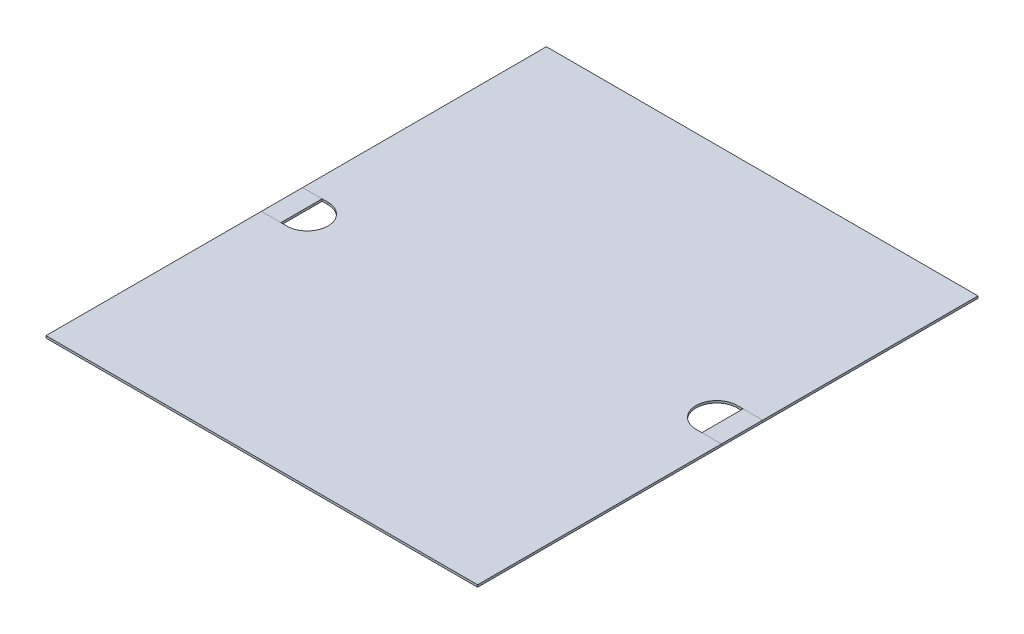
ISO-10303-21;
HEADER;
FILE_DESCRIPTION(('STEP AP214'),'2;1');
FILE_NAME('part.step','',(''),(''),'','','');
FILE_SCHEMA(('AUTOMOTIVE_DESIGN { 1 0 10303 214 1 1 1 1 }'));
ENDSEC;
DATA;
#1=APPLICATION_CONTEXT('core data for automotive mechanical design processes');
#2=APPLICATION_PROTOCOL_DEFINITION('international standard','automotive_design',2000,#1);
#3=PRODUCT_CONTEXT('',#1,'mechanical');
#4=PRODUCT('Part','Part','',(#3));
#5=PRODUCT_RELATED_PRODUCT_CATEGORY('part','',(#4));
#6=PRODUCT_DEFINITION_FORMATION('','',#4);
#7=PRODUCT_DEFINITION_CONTEXT('part definition',#1,'design');
#8=PRODUCT_DEFINITION('design','',#6,#7);
#9=PRODUCT_DEFINITION_SHAPE('','',#8);
#10=(LENGTH_UNIT() NAMED_UNIT(*) SI_UNIT(.MILLI.,.METRE.));
#11=(NAMED_UNIT(*) PLANE_ANGLE_UNIT() SI_UNIT($,.RADIAN.));
#12=(NAMED_UNIT(*) SI_UNIT($,.STERADIAN.) SOLID_ANGLE_UNIT());
#13=UNCERTAINTY_MEASURE_WITH_UNIT(LENGTH_MEASURE(1.E-05),#10,'distance_accuracy_value','');
#14=(GEOMETRIC_REPRESENTATION_CONTEXT(3) GLOBAL_UNCERTAINTY_ASSIGNED_CONTEXT((#13)) GLOBAL_UNIT_ASSIGNED_CONTEXT((#10,
#11,#12)) REPRESENTATION_CONTEXT('',''));
#15=CARTESIAN_POINT('',(0.,0.,0.));
#16=DIRECTION('',(0.,0.,1.));
#17=DIRECTION('',(1.,0.,0.));
#18=AXIS2_PLACEMENT_3D('',#15,#16,#17);
#19=CARTESIAN_POINT('',(198.959369160678,0.,-131.450000000058));
#20=DIRECTION('',(1.,0.,0.));
#21=DIRECTION('',(0.,0.,-1.));
#22=AXIS2_PLACEMENT_3D('',#19,#20,#21);
#23=PLANE('',#22);
#24=DIRECTION('',(0.,0.,-1.));
#25=VECTOR('',#24,1.);
#26=CARTESIAN_POINT('',(198.959369160678,1.,-131.450000000058));
#27=LINE('',#26,#25);
#28=CARTESIAN_POINT('',(198.959369160678,1.,-112.450000000058));
#29=VERTEX_POINT('',#28);
#30=CARTESIAN_POINT('',(198.959369160678,1.,-131.450000000058));
#31=VERTEX_POINT('',#30);
#32=EDGE_CURVE('E12',#29,#31,#27,.T.);
#33=ORIENTED_EDGE('',*,*,#32,.F.);
#34=DIRECTION('',(0.,1.,0.));
#35=VECTOR('',#34,1.);
#36=CARTESIAN_POINT('',(198.959369160678,0.,-112.450000000058));
#37=LINE('',#36,#35);
#38=CARTESIAN_POINT('',(198.959369160678,0.,-112.450000000058));
#39=VERTEX_POINT('',#38);
#40=EDGE_CURVE('E101',#39,#29,#37,.T.);
#41=ORIENTED_EDGE('',*,*,#40,.F.);
#42=DIRECTION('',(0.,0.,-1.));
#43=VECTOR('',#42,1.);
#44=CARTESIAN_POINT('',(198.959369160678,0.,-131.450000000058));
#45=LINE('',#44,#43);
#46=CARTESIAN_POINT('',(198.959369160678,0.,-131.450000000058));
#47=VERTEX_POINT('',#46);
#48=EDGE_CURVE('E58',#39,#47,#45,.T.);
#49=ORIENTED_EDGE('',*,*,#48,.T.);
#50=DIRECTION('',(0.,1.,0.));
#51=VECTOR('',#50,1.);
#52=CARTESIAN_POINT('',(198.959369160678,0.,-131.450000000058));
#53=LINE('',#52,#51);
#54=EDGE_CURVE('E73',#47,#31,#53,.T.);
#55=ORIENTED_EDGE('',*,*,#54,.T.);
#56=EDGE_LOOP('',(#33,#41,#49,#55));
#57=FACE_BOUND('',#56,.T.);
#58=ADVANCED_FACE('F54',(#57),#23,.T.);
#59=CARTESIAN_POINT('',(198.959369160678,0.,-112.450000000058));
#60=DIRECTION('',(0.,0.,1.));
#61=DIRECTION('',(1.,0.,0.));
#62=AXIS2_PLACEMENT_3D('',#59,#60,#61);
#63=PLANE('',#62);
#64=DIRECTION('',(1.,0.,0.));
#65=VECTOR('',#64,1.);
#66=CARTESIAN_POINT('',(198.959369160678,1.,-112.450000000058));
#67=LINE('',#66,#65);
#68=CARTESIAN_POINT('',(189.959369160678,1.,-112.450000000058));
#69=VERTEX_POINT('',#68);
#70=EDGE_CURVE('E114',#69,#29,#67,.T.);
#71=ORIENTED_EDGE('',*,*,#70,.F.);
#72=DIRECTION('',(0.,1.,0.));
#73=VECTOR('',#72,1.);
#74=CARTESIAN_POINT('',(189.959369160678,0.,-112.450000000058));
#75=LINE('',#74,#73);
#76=CARTESIAN_POINT('',(189.959369160678,0.,-112.450000000058));
#77=VERTEX_POINT('',#76);
#78=EDGE_CURVE('E103',#77,#69,#75,.T.);
#79=ORIENTED_EDGE('',*,*,#78,.F.);
#80=DIRECTION('',(1.,0.,0.));
#81=VECTOR('',#80,1.);
#82=CARTESIAN_POINT('',(198.959369160678,0.,-112.450000000058));
#83=LINE('',#82,#81);
#84=EDGE_CURVE('E122',#77,#39,#83,.T.);
#85=ORIENTED_EDGE('',*,*,#84,.T.);
#86=ORIENTED_EDGE('',*,*,#40,.T.);
#87=EDGE_LOOP('',(#71,#79,#85,#86));
#88=FACE_BOUND('',#87,.T.);
#89=ADVANCED_FACE('F116',(#88),#63,.T.);
#90=CARTESIAN_POINT('',(189.959369160678,0.,-131.450000000058));
#91=DIRECTION('',(-1.,0.,0.));
#92=DIRECTION('',(0.,0.,1.));
#93=AXIS2_PLACEMENT_3D('',#90,#91,#92);
#94=PLANE('',#93);
#95=DIRECTION('',(0.,0.,1.));
#96=VECTOR('',#95,1.);
#97=CARTESIAN_POINT('',(189.959369160678,1.,-131.450000000058));
#98=LINE('',#97,#96);
#99=CARTESIAN_POINT('',(189.959369160678,1.,-131.450000000058));
#100=VERTEX_POINT('',#99);
#101=EDGE_CURVE('E106',#100,#69,#98,.T.);
#102=ORIENTED_EDGE('',*,*,#101,.F.);
#103=DIRECTION('',(0.,1.,0.));
#104=VECTOR('',#103,1.);
#105=CARTESIAN_POINT('',(189.959369160678,0.,-131.450000000058));
#106=LINE('',#105,#104);
#107=CARTESIAN_POINT('',(189.959369160678,0.,-131.450000000058));
#108=VERTEX_POINT('',#107);
#109=EDGE_CURVE('E90',#108,#100,#106,.T.);
#110=ORIENTED_EDGE('',*,*,#109,.F.);
#111=DIRECTION('',(0.,0.,1.));
#112=VECTOR('',#111,1.);
#113=CARTESIAN_POINT('',(189.959369160678,0.,-131.450000000058));
#114=LINE('',#113,#112);
#115=EDGE_CURVE('E108',#108,#77,#114,.T.);
#116=ORIENTED_EDGE('',*,*,#115,.T.);
#117=ORIENTED_EDGE('',*,*,#78,.T.);
#118=EDGE_LOOP('',(#102,#110,#116,#117));
#119=FACE_BOUND('',#118,.T.);
#120=ADVANCED_FACE('F105',(#119),#94,.T.);
#121=CARTESIAN_POINT('',(198.959369160678,0.,-131.450000000058));
#122=DIRECTION('',(0.,0.,-1.));
#123=DIRECTION('',(-1.,0.,0.));
#124=AXIS2_PLACEMENT_3D('',#121,#122,#123);
#125=PLANE('',#124);
#126=DIRECTION('',(-1.,0.,0.));
#127=VECTOR('',#126,1.);
#128=CARTESIAN_POINT('',(198.959369160678,1.,-131.450000000058));
#129=LINE('',#128,#127);
#130=EDGE_CURVE('E64',#31,#100,#129,.T.);
#131=ORIENTED_EDGE('',*,*,#130,.F.);
#132=ORIENTED_EDGE('',*,*,#54,.F.);
#133=DIRECTION('',(-1.,0.,0.));
#134=VECTOR('',#133,1.);
#135=CARTESIAN_POINT('',(198.959369160678,0.,-131.450000000058));
#136=LINE('',#135,#134);
#137=EDGE_CURVE('E118',#47,#108,#136,.T.);
#138=ORIENTED_EDGE('',*,*,#137,.T.);
#139=ORIENTED_EDGE('',*,*,#109,.T.);
#140=EDGE_LOOP('',(#131,#132,#138,#139));
#141=FACE_BOUND('',#140,.T.);
#142=ADVANCED_FACE('F124',(#141),#125,.T.);
#143=CARTESIAN_POINT('',(0.,0.,0.));
#144=DIRECTION('',(0.,-1.,0.));
#145=DIRECTION('',(0.,0.,-1.));
#146=AXIS2_PLACEMENT_3D('',#143,#144,#145);
#147=PLANE('',#146);
#148=ORIENTED_EDGE('',*,*,#48,.F.);
#149=ORIENTED_EDGE('',*,*,#84,.F.);
#150=ORIENTED_EDGE('',*,*,#115,.F.);
#151=ORIENTED_EDGE('',*,*,#137,.F.);
#152=EDGE_LOOP('',(#148,#149,#150,#151));
#153=FACE_BOUND('',#152,.T.);
#154=ADVANCED_FACE('F56',(#153),#147,.T.);
#155=CARTESIAN_POINT('',(0.,1.,0.));
#156=DIRECTION('',(0.,-1.,0.));
#157=DIRECTION('',(0.,0.,-1.));
#158=AXIS2_PLACEMENT_3D('',#155,#156,#157);
#159=PLANE('',#158);
#160=ORIENTED_EDGE('',*,*,#32,.T.);
#161=ORIENTED_EDGE('',*,*,#130,.T.);
#162=ORIENTED_EDGE('',*,*,#101,.T.);
#163=ORIENTED_EDGE('',*,*,#70,.T.);
#164=EDGE_LOOP('',(#160,#161,#162,#163));
#165=FACE_BOUND('',#164,.T.);
#166=ADVANCED_FACE('F113',(#165),#159,.F.);
#167=CLOSED_SHELL('',(#58,#89,#120,#142,#154,#166));
#168=MANIFOLD_SOLID_BREP('B2',#167);
#169=CARTESIAN_POINT('',(0.0406308393223753,0.,-118.25));
#170=DIRECTION('',(-1.,0.,0.));
#171=DIRECTION('',(0.,0.,1.));
#172=AXIS2_PLACEMENT_3D('',#169,#170,#171);
#173=PLANE('',#172);
#174=DIRECTION('',(0.,0.,1.));
#175=VECTOR('',#174,1.);
#176=CARTESIAN_POINT('',(0.0406308393223753,1.,-118.25));
#177=LINE('',#176,#175);
#178=CARTESIAN_POINT('',(0.0406308393223753,1.,-118.25));
#179=VERTEX_POINT('',#178);
#180=CARTESIAN_POINT('',(0.0406308393223753,1.,-99.25));
#181=VERTEX_POINT('',#180);
#182=EDGE_CURVE('E263',#179,#181,#177,.T.);
#183=ORIENTED_EDGE('',*,*,#182,.F.);
#184=DIRECTION('',(0.,1.,0.));
#185=VECTOR('',#184,1.);
#186=CARTESIAN_POINT('',(0.0406308393223753,0.,-118.25));
#187=LINE('',#186,#185);
#188=CARTESIAN_POINT('',(0.0406308393223753,0.,-118.25));
#189=VERTEX_POINT('',#188);
#190=EDGE_CURVE('E52',#189,#179,#187,.T.);
#191=ORIENTED_EDGE('',*,*,#190,.F.);
#192=DIRECTION('',(0.,0.,1.));
#193=VECTOR('',#192,1.);
#194=CARTESIAN_POINT('',(0.0406308393223753,0.,-118.25));
#195=LINE('',#194,#193);
#196=CARTESIAN_POINT('',(0.0406308393223753,0.,-99.25));
#197=VERTEX_POINT('',#196);
#198=EDGE_CURVE('E257',#189,#197,#195,.T.);
#199=ORIENTED_EDGE('',*,*,#198,.T.);
#200=DIRECTION('',(0.,1.,0.));
#201=VECTOR('',#200,1.);
#202=CARTESIAN_POINT('',(0.0406308393223753,0.,-99.25));
#203=LINE('',#202,#201);
#204=EDGE_CURVE('E202',#197,#181,#203,.T.);
#205=ORIENTED_EDGE('',*,*,#204,.T.);
#206=EDGE_LOOP('',(#183,#191,#199,#205));
#207=FACE_BOUND('',#206,.T.);
#208=ADVANCED_FACE('F199',(#207),#173,.T.);
#209=CARTESIAN_POINT('',(0.0406308393223753,0.,-118.25));
#210=DIRECTION('',(0.,0.,-1.));
#211=DIRECTION('',(-1.,0.,0.));
#212=AXIS2_PLACEMENT_3D('',#209,#210,#211);
#213=PLANE('',#212);
#214=DIRECTION('',(-1.,0.,0.));
#215=VECTOR('',#214,1.);
#216=CARTESIAN_POINT('',(0.0406308393223753,1.,-118.25));
#217=LINE('',#216,#215);
#218=CARTESIAN_POINT('',(9.04063083932238,1.,-118.25));
#219=VERTEX_POINT('',#218);
#220=EDGE_CURVE('E259',#219,#179,#217,.T.);
#221=ORIENTED_EDGE('',*,*,#220,.F.);
#222=DIRECTION('',(0.,1.,0.));
#223=VECTOR('',#222,1.);
#224=CARTESIAN_POINT('',(9.04063083932238,0.,-118.25));
#225=LINE('',#224,#223);
#226=CARTESIAN_POINT('',(9.04063083932238,0.,-118.25));
#227=VERTEX_POINT('',#226);
#228=EDGE_CURVE('E208',#227,#219,#225,.T.);
#229=ORIENTED_EDGE('',*,*,#228,.F.);
#230=DIRECTION('',(-1.,0.,0.));
#231=VECTOR('',#230,1.);
#232=CARTESIAN_POINT('',(0.0406308393223753,0.,-118.25));
#233=LINE('',#232,#231);
#234=EDGE_CURVE('E254',#227,#189,#233,.T.);
#235=ORIENTED_EDGE('',*,*,#234,.T.);
#236=ORIENTED_EDGE('',*,*,#190,.T.);
#237=EDGE_LOOP('',(#221,#229,#235,#236));
#238=FACE_BOUND('',#237,.T.);
#239=ADVANCED_FACE('F273',(#238),#213,.T.);
#240=CARTESIAN_POINT('',(9.04063083932238,0.,-118.25));
#241=DIRECTION('',(1.,0.,0.));
#242=DIRECTION('',(0.,0.,-1.));
#243=AXIS2_PLACEMENT_3D('',#240,#241,#242);
#244=PLANE('',#243);
#245=DIRECTION('',(0.,0.,-1.));
#246=VECTOR('',#245,1.);
#247=CARTESIAN_POINT('',(9.04063083932238,1.,-118.25));
#248=LINE('',#247,#246);
#249=CARTESIAN_POINT('',(9.04063083932238,1.,-99.25));
#250=VERTEX_POINT('',#249);
#251=EDGE_CURVE('E249',#250,#219,#248,.T.);
#252=ORIENTED_EDGE('',*,*,#251,.F.);
#253=DIRECTION('',(0.,1.,0.));
#254=VECTOR('',#253,1.);
#255=CARTESIAN_POINT('',(9.04063083932238,0.,-99.25));
#256=LINE('',#255,#254);
#257=CARTESIAN_POINT('',(9.04063083932238,0.,-99.25));
#258=VERTEX_POINT('',#257);
#259=EDGE_CURVE('E244',#258,#250,#256,.T.);
#260=ORIENTED_EDGE('',*,*,#259,.F.);
#261=DIRECTION('',(0.,0.,-1.));
#262=VECTOR('',#261,1.);
#263=CARTESIAN_POINT('',(9.04063083932238,0.,-118.25));
#264=LINE('',#263,#262);
#265=EDGE_CURVE('E247',#258,#227,#264,.T.);
#266=ORIENTED_EDGE('',*,*,#265,.T.);
#267=ORIENTED_EDGE('',*,*,#228,.T.);
#268=EDGE_LOOP('',(#252,#260,#266,#267));
#269=FACE_BOUND('',#268,.T.);
#270=ADVANCED_FACE('F246',(#269),#244,.T.);
#271=CARTESIAN_POINT('',(0.0406308393223753,0.,-99.25));
#272=DIRECTION('',(0.,0.,1.));
#273=DIRECTION('',(1.,0.,0.));
#274=AXIS2_PLACEMENT_3D('',#271,#272,#273);
#275=PLANE('',#274);
#276=DIRECTION('',(1.,0.,0.));
#277=VECTOR('',#276,1.);
#278=CARTESIAN_POINT('',(0.0406308393223753,1.,-99.25));
#279=LINE('',#278,#277);
#280=EDGE_CURVE('E266',#181,#250,#279,.T.);
#281=ORIENTED_EDGE('',*,*,#280,.F.);
#282=ORIENTED_EDGE('',*,*,#204,.F.);
#283=DIRECTION('',(1.,0.,0.));
#284=VECTOR('',#283,1.);
#285=CARTESIAN_POINT('',(0.0406308393223753,0.,-99.25));
#286=LINE('',#285,#284);
#287=EDGE_CURVE('E253',#197,#258,#286,.T.);
#288=ORIENTED_EDGE('',*,*,#287,.T.);
#289=ORIENTED_EDGE('',*,*,#259,.T.);
#290=EDGE_LOOP('',(#281,#282,#288,#289));
#291=FACE_BOUND('',#290,.T.);
#292=ADVANCED_FACE('F256',(#291),#275,.T.);
#293=CARTESIAN_POINT('',(0.,0.,0.));
#294=DIRECTION('',(0.,1.,0.));
#295=DIRECTION('',(0.,0.,1.));
#296=AXIS2_PLACEMENT_3D('',#293,#294,#295);
#297=PLANE('',#296);
#298=ORIENTED_EDGE('',*,*,#198,.F.);
#299=ORIENTED_EDGE('',*,*,#234,.F.);
#300=ORIENTED_EDGE('',*,*,#265,.F.);
#301=ORIENTED_EDGE('',*,*,#287,.F.);
#302=EDGE_LOOP('',(#298,#299,#300,#301));
#303=FACE_BOUND('',#302,.T.);
#304=ADVANCED_FACE('F252',(#303),#297,.F.);
#305=CARTESIAN_POINT('',(0.,1.,0.));
#306=DIRECTION('',(0.,1.,0.));
#307=DIRECTION('',(0.,0.,1.));
#308=AXIS2_PLACEMENT_3D('',#305,#306,#307);
#309=PLANE('',#308);
#310=ORIENTED_EDGE('',*,*,#182,.T.);
#311=ORIENTED_EDGE('',*,*,#280,.T.);
#312=ORIENTED_EDGE('',*,*,#251,.T.);
#313=ORIENTED_EDGE('',*,*,#220,.T.);
#314=EDGE_LOOP('',(#310,#311,#312,#313));
#315=FACE_BOUND('',#314,.T.);
#316=ADVANCED_FACE('F272',(#315),#309,.T.);
#317=CLOSED_SHELL('',(#208,#239,#270,#292,#304,#316));
#318=MANIFOLD_SOLID_BREP('B6',#317);
#319=CARTESIAN_POINT('',(0.0406308393223753,1.,-99.25));
#320=DIRECTION('',(0.999999916204537,0.,0.000409378699422623));
#321=DIRECTION('',(0.000409378699422623,0.,-0.999999916204537));
#322=AXIS2_PLACEMENT_3D('',#319,#320,#321);
#323=PLANE('',#322);
#324=DIRECTION('',(-0.000409378699422623,0.,0.999999916204537));
#325=VECTOR('',#324,1.);
#326=CARTESIAN_POINT('',(0.0406308393223753,0.,-99.25));
#327=LINE('',#326,#325);
#328=CARTESIAN_POINT('',(0.0406308393223753,0.,-99.25));
#329=VERTEX_POINT('',#328);
#330=CARTESIAN_POINT('',(0.,0.,0.));
#331=VERTEX_POINT('',#330);
#332=EDGE_CURVE('E460',#329,#331,#327,.T.);
#333=ORIENTED_EDGE('',*,*,#332,.T.);
#334=DIRECTION('',(0.,-1.,0.));
#335=VECTOR('',#334,1.);
#336=CARTESIAN_POINT('',(0.,1.,0.));
#337=LINE('',#336,#335);
#338=CARTESIAN_POINT('',(0.,1.,0.));
#339=VERTEX_POINT('',#338);
#340=EDGE_CURVE('E197',#339,#331,#337,.T.);
#341=ORIENTED_EDGE('',*,*,#340,.F.);
#342=DIRECTION('',(-0.000409378699422623,0.,0.999999916204537));
#343=VECTOR('',#342,1.);
#344=CARTESIAN_POINT('',(0.0406308393223753,1.,-99.25));
#345=LINE('',#344,#343);
#346=CARTESIAN_POINT('',(0.0406308393223753,1.,-99.25));
#347=VERTEX_POINT('',#346);
#348=EDGE_CURVE('E494',#347,#339,#345,.T.);
#349=ORIENTED_EDGE('',*,*,#348,.F.);
#350=DIRECTION('',(0.,-1.,0.));
#351=VECTOR('',#350,1.);
#352=CARTESIAN_POINT('',(0.0406308393223753,1.,-99.25));
#353=LINE('',#352,#351);
#354=EDGE_CURVE('E456',#347,#329,#353,.T.);
#355=ORIENTED_EDGE('',*,*,#354,.T.);
#356=EDGE_LOOP('',(#333,#341,#349,#355));
#357=FACE_BOUND('',#356,.T.);
#358=ADVANCED_FACE('F335',(#357),#323,.F.);
#359=CARTESIAN_POINT('',(0.,1.,0.));
#360=DIRECTION('',(0.,0.,-1.));
#361=DIRECTION('',(-1.,0.,0.));
#362=AXIS2_PLACEMENT_3D('',#359,#360,#361);
#363=PLANE('',#362);
#364=DIRECTION('',(1.,0.,0.));
#365=VECTOR('',#364,1.);
#366=CARTESIAN_POINT('',(0.,0.,0.));
#367=LINE('',#366,#365);
#368=CARTESIAN_POINT('',(199.,0.,0.));
#369=VERTEX_POINT('',#368);
#370=EDGE_CURVE('E464',#331,#369,#367,.T.);
#371=ORIENTED_EDGE('',*,*,#370,.T.);
#372=DIRECTION('',(0.,-1.,0.));
#373=VECTOR('',#372,1.);
#374=CARTESIAN_POINT('',(199.,1.,0.));
#375=LINE('',#374,#373);
#376=CARTESIAN_POINT('',(199.,1.,0.));
#377=VERTEX_POINT('',#376);
#378=EDGE_CURVE('E344',#377,#369,#375,.T.);
#379=ORIENTED_EDGE('',*,*,#378,.F.);
#380=DIRECTION('',(1.,0.,0.));
#381=VECTOR('',#380,1.);
#382=CARTESIAN_POINT('',(0.,1.,0.));
#383=LINE('',#382,#381);
#384=EDGE_CURVE('E407',#339,#377,#383,.T.);
#385=ORIENTED_EDGE('',*,*,#384,.F.);
#386=ORIENTED_EDGE('',*,*,#340,.T.);
#387=EDGE_LOOP('',(#371,#379,#385,#386));
#388=FACE_BOUND('',#387,.T.);
#389=ADVANCED_FACE('F588',(#388),#363,.F.);
#390=CARTESIAN_POINT('',(198.959369160678,1.,-112.450000000058));
#391=DIRECTION('',(-0.999999934722633,0.,0.00036132358088135));
#392=DIRECTION('',(0.00036132358088135,0.,0.999999934722633));
#393=AXIS2_PLACEMENT_3D('',#390,#391,#392);
#394=PLANE('',#393);
#395=DIRECTION('',(-0.00036132358088135,0.,-0.999999934722633));
#396=VECTOR('',#395,1.);
#397=CARTESIAN_POINT('',(198.959369160678,0.,-112.450000000058));
#398=LINE('',#397,#396);
#399=CARTESIAN_POINT('',(198.959369160678,0.,-112.450000000058));
#400=VERTEX_POINT('',#399);
#401=EDGE_CURVE('E467',#369,#400,#398,.T.);
#402=ORIENTED_EDGE('',*,*,#401,.T.);
#403=DIRECTION('',(0.,-1.,0.));
#404=VECTOR('',#403,1.);
#405=CARTESIAN_POINT('',(198.959369160678,1.,-112.450000000058));
#406=LINE('',#405,#404);
#407=CARTESIAN_POINT('',(198.959369160678,1.,-112.450000000058));
#408=VERTEX_POINT('',#407);
#409=EDGE_CURVE('E521',#408,#400,#406,.T.);
#410=ORIENTED_EDGE('',*,*,#409,.F.);
#411=DIRECTION('',(-0.00036132358088135,0.,-0.999999934722633));
#412=VECTOR('',#411,1.);
#413=CARTESIAN_POINT('',(198.959369160678,1.,-112.450000000058));
#414=LINE('',#413,#412);
#415=EDGE_CURVE('E531',#377,#408,#414,.T.);
#416=ORIENTED_EDGE('',*,*,#415,.F.);
#417=ORIENTED_EDGE('',*,*,#378,.T.);
#418=EDGE_LOOP('',(#402,#410,#416,#417));
#419=FACE_BOUND('',#418,.T.);
#420=ADVANCED_FACE('F529',(#419),#394,.F.);
#421=CARTESIAN_POINT('',(187.25,1.,-112.450000000058));
#422=DIRECTION('',(0.,0.,1.));
#423=DIRECTION('',(1.,0.,0.));
#424=AXIS2_PLACEMENT_3D('',#421,#422,#423);
#425=PLANE('',#424);
#426=DIRECTION('',(-1.,0.,0.));
#427=VECTOR('',#426,1.);
#428=CARTESIAN_POINT('',(187.25,0.,-112.450000000058));
#429=LINE('',#428,#427);
#430=CARTESIAN_POINT('',(187.25,0.,-112.450000000058));
#431=VERTEX_POINT('',#430);
#432=EDGE_CURVE('E470',#400,#431,#429,.T.);
#433=ORIENTED_EDGE('',*,*,#432,.T.);
#434=DIRECTION('',(0.,-1.,0.));
#435=VECTOR('',#434,1.);
#436=CARTESIAN_POINT('',(187.25,1.,-112.450000000058));
#437=LINE('',#436,#435);
#438=CARTESIAN_POINT('',(187.25,1.,-112.450000000058));
#439=VERTEX_POINT('',#438);
#440=EDGE_CURVE('E517',#439,#431,#437,.T.);
#441=ORIENTED_EDGE('',*,*,#440,.F.);
#442=DIRECTION('',(-1.,0.,0.));
#443=VECTOR('',#442,1.);
#444=CARTESIAN_POINT('',(187.25,1.,-112.450000000058));
#445=LINE('',#444,#443);
#446=EDGE_CURVE('E550',#408,#439,#445,.T.);
#447=ORIENTED_EDGE('',*,*,#446,.F.);
#448=ORIENTED_EDGE('',*,*,#409,.T.);
#449=EDGE_LOOP('',(#433,#441,#447,#448));
#450=FACE_BOUND('',#449,.T.);
#451=ADVANCED_FACE('F540',(#450),#425,.F.);
#452=CARTESIAN_POINT('',(187.25,1.,-121.950000000058));
#453=DIRECTION('',(0.,-1.,0.));
#454=DIRECTION('',(0.,0.,-1.));
#455=AXIS2_PLACEMENT_3D('',#452,#453,#454);
#456=CYLINDRICAL_SURFACE('',#455,9.49999999999999);
#457=CARTESIAN_POINT('',(187.25,0.,-121.950000000058));
#458=DIRECTION('',(0.,-1.,0.));
#459=DIRECTION('',(0.,0.,1.));
#460=AXIS2_PLACEMENT_3D('',#457,#458,#459);
#461=CIRCLE('',#460,9.49999999999999);
#462=CARTESIAN_POINT('',(187.25,0.,-131.450000000058));
#463=VERTEX_POINT('',#462);
#464=EDGE_CURVE('E473',#431,#463,#461,.T.);
#465=ORIENTED_EDGE('',*,*,#464,.T.);
#466=DIRECTION('',(0.,-1.,0.));
#467=VECTOR('',#466,1.);
#468=CARTESIAN_POINT('',(187.25,1.,-131.450000000058));
#469=LINE('',#468,#467);
#470=CARTESIAN_POINT('',(187.25,1.,-131.450000000058));
#471=VERTEX_POINT('',#470);
#472=EDGE_CURVE('E513',#471,#463,#469,.T.);
#473=ORIENTED_EDGE('',*,*,#472,.F.);
#474=CARTESIAN_POINT('',(187.25,1.,-121.950000000058));
#475=DIRECTION('',(0.,-1.,0.));
#476=DIRECTION('',(0.,0.,1.));
#477=AXIS2_PLACEMENT_3D('',#474,#475,#476);
#478=CIRCLE('',#477,9.49999999999999);
#479=EDGE_CURVE('E546',#439,#471,#478,.T.);
#480=ORIENTED_EDGE('',*,*,#479,.F.);
#481=ORIENTED_EDGE('',*,*,#440,.T.);
#482=EDGE_LOOP('',(#465,#473,#480,#481));
#483=FACE_BOUND('',#482,.T.);
#484=ADVANCED_FACE('F544',(#483),#456,.F.);
#485=CARTESIAN_POINT('',(187.25,1.,-131.450000000058));
#486=DIRECTION('',(0.,0.,-1.));
#487=DIRECTION('',(-1.,0.,0.));
#488=AXIS2_PLACEMENT_3D('',#485,#486,#487);
#489=PLANE('',#488);
#490=DIRECTION('',(1.,0.,0.));
#491=VECTOR('',#490,1.);
#492=CARTESIAN_POINT('',(187.25,0.,-131.450000000058));
#493=LINE('',#492,#491);
#494=CARTESIAN_POINT('',(198.959369160678,0.,-131.450000000058));
#495=VERTEX_POINT('',#494);
#496=EDGE_CURVE('E476',#463,#495,#493,.T.);
#497=ORIENTED_EDGE('',*,*,#496,.T.);
#498=DIRECTION('',(0.,-1.,0.));
#499=VECTOR('',#498,1.);
#500=CARTESIAN_POINT('',(198.959369160678,1.,-131.450000000058));
#501=LINE('',#500,#499);
#502=CARTESIAN_POINT('',(198.959369160678,1.,-131.450000000058));
#503=VERTEX_POINT('',#502);
#504=EDGE_CURVE('E509',#503,#495,#501,.T.);
#505=ORIENTED_EDGE('',*,*,#504,.F.);
#506=DIRECTION('',(1.,0.,0.));
#507=VECTOR('',#506,1.);
#508=CARTESIAN_POINT('',(187.25,1.,-131.450000000058));
#509=LINE('',#508,#507);
#510=EDGE_CURVE('E549',#471,#503,#509,.T.);
#511=ORIENTED_EDGE('',*,*,#510,.F.);
#512=ORIENTED_EDGE('',*,*,#472,.T.);
#513=EDGE_LOOP('',(#497,#505,#511,#512));
#514=FACE_BOUND('',#513,.T.);
#515=ADVANCED_FACE('F601',(#514),#489,.F.);
#516=CARTESIAN_POINT('',(199.,1.,-230.7));
#517=DIRECTION('',(-0.999999916204537,0.,-0.000409378699423142));
#518=DIRECTION('',(-0.000409378699423142,0.,0.999999916204537));
#519=AXIS2_PLACEMENT_3D('',#516,#517,#518);
#520=PLANE('',#519);
#521=DIRECTION('',(0.000409378699423142,0.,-0.999999916204537));
#522=VECTOR('',#521,1.);
#523=CARTESIAN_POINT('',(199.,0.,-230.7));
#524=LINE('',#523,#522);
#525=CARTESIAN_POINT('',(199.,0.,-230.7));
#526=VERTEX_POINT('',#525);
#527=EDGE_CURVE('E479',#495,#526,#524,.T.);
#528=ORIENTED_EDGE('',*,*,#527,.T.);
#529=DIRECTION('',(0.,-1.,0.));
#530=VECTOR('',#529,1.);
#531=CARTESIAN_POINT('',(199.,1.,-230.7));
#532=LINE('',#531,#530);
#533=CARTESIAN_POINT('',(199.,1.,-230.7));
#534=VERTEX_POINT('',#533);
#535=EDGE_CURVE('E505',#534,#526,#532,.T.);
#536=ORIENTED_EDGE('',*,*,#535,.F.);
#537=DIRECTION('',(0.000409378699423142,0.,-0.999999916204537));
#538=VECTOR('',#537,1.);
#539=CARTESIAN_POINT('',(199.,1.,-230.7));
#540=LINE('',#539,#538);
#541=EDGE_CURVE('E554',#503,#534,#540,.T.);
#542=ORIENTED_EDGE('',*,*,#541,.F.);
#543=ORIENTED_EDGE('',*,*,#504,.T.);
#544=EDGE_LOOP('',(#528,#536,#542,#543));
#545=FACE_BOUND('',#544,.T.);
#546=ADVANCED_FACE('F604',(#545),#520,.F.);
#547=CARTESIAN_POINT('',(0.,1.,-230.7));
#548=DIRECTION('',(0.,0.,1.));
#549=DIRECTION('',(1.,0.,0.));
#550=AXIS2_PLACEMENT_3D('',#547,#548,#549);
#551=PLANE('',#550);
#552=DIRECTION('',(-1.,0.,0.));
#553=VECTOR('',#552,1.);
#554=CARTESIAN_POINT('',(0.,0.,-230.7));
#555=LINE('',#554,#553);
#556=CARTESIAN_POINT('',(0.,0.,-230.7));
#557=VERTEX_POINT('',#556);
#558=EDGE_CURVE('E482',#526,#557,#555,.T.);
#559=ORIENTED_EDGE('',*,*,#558,.T.);
#560=DIRECTION('',(0.,-1.,0.));
#561=VECTOR('',#560,1.);
#562=CARTESIAN_POINT('',(0.,1.,-230.7));
#563=LINE('',#562,#561);
#564=CARTESIAN_POINT('',(0.,1.,-230.7));
#565=VERTEX_POINT('',#564);
#566=EDGE_CURVE('E501',#565,#557,#563,.T.);
#567=ORIENTED_EDGE('',*,*,#566,.F.);
#568=DIRECTION('',(-1.,0.,0.));
#569=VECTOR('',#568,1.);
#570=CARTESIAN_POINT('',(0.,1.,-230.7));
#571=LINE('',#570,#569);
#572=EDGE_CURVE('E561',#534,#565,#571,.T.);
#573=ORIENTED_EDGE('',*,*,#572,.F.);
#574=ORIENTED_EDGE('',*,*,#535,.T.);
#575=EDGE_LOOP('',(#559,#567,#573,#574));
#576=FACE_BOUND('',#575,.T.);
#577=ADVANCED_FACE('F569',(#576),#551,.F.);
#578=CARTESIAN_POINT('',(0.0406308393223753,1.,-118.25));
#579=DIRECTION('',(0.999999934722633,0.,-0.00036132358088129));
#580=DIRECTION('',(-0.00036132358088129,0.,-0.999999934722633));
#581=AXIS2_PLACEMENT_3D('',#578,#579,#580);
#582=PLANE('',#581);
#583=DIRECTION('',(0.00036132358088129,0.,0.999999934722633));
#584=VECTOR('',#583,1.);
#585=CARTESIAN_POINT('',(0.0406308393223753,0.,-118.25));
#586=LINE('',#585,#584);
#587=CARTESIAN_POINT('',(0.0406308393223753,0.,-118.25));
#588=VERTEX_POINT('',#587);
#589=EDGE_CURVE('E485',#557,#588,#586,.T.);
#590=ORIENTED_EDGE('',*,*,#589,.T.);
#591=DIRECTION('',(0.,-1.,0.));
#592=VECTOR('',#591,1.);
#593=CARTESIAN_POINT('',(0.0406308393223753,1.,-118.25));
#594=LINE('',#593,#592);
#595=CARTESIAN_POINT('',(0.0406308393223753,1.,-118.25));
#596=VERTEX_POINT('',#595);
#597=EDGE_CURVE('E449',#596,#588,#594,.T.);
#598=ORIENTED_EDGE('',*,*,#597,.F.);
#599=DIRECTION('',(0.00036132358088129,0.,0.999999934722633));
#600=VECTOR('',#599,1.);
#601=CARTESIAN_POINT('',(0.0406308393223753,1.,-118.25));
#602=LINE('',#601,#600);
#603=EDGE_CURVE('E438',#565,#596,#602,.T.);
#604=ORIENTED_EDGE('',*,*,#603,.F.);
#605=ORIENTED_EDGE('',*,*,#566,.T.);
#606=EDGE_LOOP('',(#590,#598,#604,#605));
#607=FACE_BOUND('',#606,.T.);
#608=ADVANCED_FACE('F573',(#607),#582,.F.);
#609=CARTESIAN_POINT('',(11.75,1.,-118.25));
#610=DIRECTION('',(0.,0.,-1.));
#611=DIRECTION('',(-1.,0.,0.));
#612=AXIS2_PLACEMENT_3D('',#609,#610,#611);
#613=PLANE('',#612);
#614=DIRECTION('',(1.,0.,0.));
#615=VECTOR('',#614,1.);
#616=CARTESIAN_POINT('',(11.75,0.,-118.25));
#617=LINE('',#616,#615);
#618=CARTESIAN_POINT('',(11.75,0.,-118.25));
#619=VERTEX_POINT('',#618);
#620=EDGE_CURVE('E447',#588,#619,#617,.T.);
#621=ORIENTED_EDGE('',*,*,#620,.T.);
#622=DIRECTION('',(0.,-1.,0.));
#623=VECTOR('',#622,1.);
#624=CARTESIAN_POINT('',(11.75,1.,-118.25));
#625=LINE('',#624,#623);
#626=CARTESIAN_POINT('',(11.75,1.,-118.25));
#627=VERTEX_POINT('',#626);
#628=EDGE_CURVE('E444',#627,#619,#625,.T.);
#629=ORIENTED_EDGE('',*,*,#628,.F.);
#630=DIRECTION('',(1.,0.,0.));
#631=VECTOR('',#630,1.);
#632=CARTESIAN_POINT('',(11.75,1.,-118.25));
#633=LINE('',#632,#631);
#634=EDGE_CURVE('E432',#596,#627,#633,.T.);
#635=ORIENTED_EDGE('',*,*,#634,.F.);
#636=ORIENTED_EDGE('',*,*,#597,.T.);
#637=EDGE_LOOP('',(#621,#629,#635,#636));
#638=FACE_BOUND('',#637,.T.);
#639=ADVANCED_FACE('F445',(#638),#613,.F.);
#640=CARTESIAN_POINT('',(11.75,1.,-108.75));
#641=DIRECTION('',(0.,-1.,0.));
#642=DIRECTION('',(0.,0.,-1.));
#643=AXIS2_PLACEMENT_3D('',#640,#641,#642);
#644=CYLINDRICAL_SURFACE('',#643,9.49999999999999);
#645=CARTESIAN_POINT('',(11.75,0.,-108.75));
#646=DIRECTION('',(0.,-1.,0.));
#647=DIRECTION('',(0.,0.,1.));
#648=AXIS2_PLACEMENT_3D('',#645,#646,#647);
#649=CIRCLE('',#648,9.49999999999999);
#650=CARTESIAN_POINT('',(11.75,0.,-99.25));
#651=VERTEX_POINT('',#650);
#652=EDGE_CURVE('E393',#619,#651,#649,.T.);
#653=ORIENTED_EDGE('',*,*,#652,.T.);
#654=DIRECTION('',(0.,-1.,0.));
#655=VECTOR('',#654,1.);
#656=CARTESIAN_POINT('',(11.75,1.,-99.25));
#657=LINE('',#656,#655);
#658=CARTESIAN_POINT('',(11.75,1.,-99.25));
#659=VERTEX_POINT('',#658);
#660=EDGE_CURVE('E450',#659,#651,#657,.T.);
#661=ORIENTED_EDGE('',*,*,#660,.F.);
#662=CARTESIAN_POINT('',(11.75,1.,-108.75));
#663=DIRECTION('',(0.,-1.,0.));
#664=DIRECTION('',(0.,0.,1.));
#665=AXIS2_PLACEMENT_3D('',#662,#663,#664);
#666=CIRCLE('',#665,9.49999999999999);
#667=EDGE_CURVE('E436',#627,#659,#666,.T.);
#668=ORIENTED_EDGE('',*,*,#667,.F.);
#669=ORIENTED_EDGE('',*,*,#628,.T.);
#670=EDGE_LOOP('',(#653,#661,#668,#669));
#671=FACE_BOUND('',#670,.T.);
#672=ADVANCED_FACE('F452',(#671),#644,.F.);
#673=CARTESIAN_POINT('',(11.75,1.,-99.25));
#674=DIRECTION('',(0.,0.,1.));
#675=DIRECTION('',(1.,0.,0.));
#676=AXIS2_PLACEMENT_3D('',#673,#674,#675);
#677=PLANE('',#676);
#678=DIRECTION('',(-1.,0.,0.));
#679=VECTOR('',#678,1.);
#680=CARTESIAN_POINT('',(11.75,0.,-99.25));
#681=LINE('',#680,#679);
#682=EDGE_CURVE('E399',#651,#329,#681,.T.);
#683=ORIENTED_EDGE('',*,*,#682,.T.);
#684=ORIENTED_EDGE('',*,*,#354,.F.);
#685=DIRECTION('',(-1.,0.,0.));
#686=VECTOR('',#685,1.);
#687=CARTESIAN_POINT('',(11.75,1.,-99.25));
#688=LINE('',#687,#686);
#689=EDGE_CURVE('E352',#659,#347,#688,.T.);
#690=ORIENTED_EDGE('',*,*,#689,.F.);
#691=ORIENTED_EDGE('',*,*,#660,.T.);
#692=EDGE_LOOP('',(#683,#684,#690,#691));
#693=FACE_BOUND('',#692,.T.);
#694=ADVANCED_FACE('F577',(#693),#677,.F.);
#695=CARTESIAN_POINT('',(187.25,1.,-121.950000000058));
#696=DIRECTION('',(0.,1.,0.));
#697=DIRECTION('',(0.,0.,1.));
#698=AXIS2_PLACEMENT_3D('',#695,#696,#697);
#699=PLANE('',#698);
#700=ORIENTED_EDGE('',*,*,#348,.T.);
#701=ORIENTED_EDGE('',*,*,#384,.T.);
#702=ORIENTED_EDGE('',*,*,#415,.T.);
#703=ORIENTED_EDGE('',*,*,#446,.T.);
#704=ORIENTED_EDGE('',*,*,#479,.T.);
#705=ORIENTED_EDGE('',*,*,#510,.T.);
#706=ORIENTED_EDGE('',*,*,#541,.T.);
#707=ORIENTED_EDGE('',*,*,#572,.T.);
#708=ORIENTED_EDGE('',*,*,#603,.T.);
#709=ORIENTED_EDGE('',*,*,#634,.T.);
#710=ORIENTED_EDGE('',*,*,#667,.T.);
#711=ORIENTED_EDGE('',*,*,#689,.T.);
#712=EDGE_LOOP('',(#700,#701,#702,#703,#704,#705,#706,#707,#708,#709,#710,#711));
#713=FACE_BOUND('',#712,.T.);
#714=ADVANCED_FACE('F434',(#713),#699,.T.);
#715=CARTESIAN_POINT('',(187.25,0.,-121.950000000058));
#716=DIRECTION('',(0.,1.,0.));
#717=DIRECTION('',(0.,0.,1.));
#718=AXIS2_PLACEMENT_3D('',#715,#716,#717);
#719=PLANE('',#718);
#720=ORIENTED_EDGE('',*,*,#332,.F.);
#721=ORIENTED_EDGE('',*,*,#682,.F.);
#722=ORIENTED_EDGE('',*,*,#652,.F.);
#723=ORIENTED_EDGE('',*,*,#620,.F.);
#724=ORIENTED_EDGE('',*,*,#589,.F.);
#725=ORIENTED_EDGE('',*,*,#558,.F.);
#726=ORIENTED_EDGE('',*,*,#527,.F.);
#727=ORIENTED_EDGE('',*,*,#496,.F.);
#728=ORIENTED_EDGE('',*,*,#464,.F.);
#729=ORIENTED_EDGE('',*,*,#432,.F.);
#730=ORIENTED_EDGE('',*,*,#401,.F.);
#731=ORIENTED_EDGE('',*,*,#370,.F.);
#732=EDGE_LOOP('',(#720,#721,#722,#723,#724,#725,#726,#727,#728,#729,#730,#731));
#733=FACE_BOUND('',#732,.T.);
#734=ADVANCED_FACE('F535',(#733),#719,.F.);
#735=CLOSED_SHELL('',(#358,#389,#420,#451,#484,#515,#546,#577,#608,#639,#672,#694,#714,#734));
#736=MANIFOLD_SOLID_BREP('B46',#735);
#737=ADVANCED_BREP_SHAPE_REPRESENTATION('',(#18,#168,#318,#736),#14);
#738=SHAPE_DEFINITION_REPRESENTATION(#9,#737);
ENDSEC;
END-ISO-10303-21;
